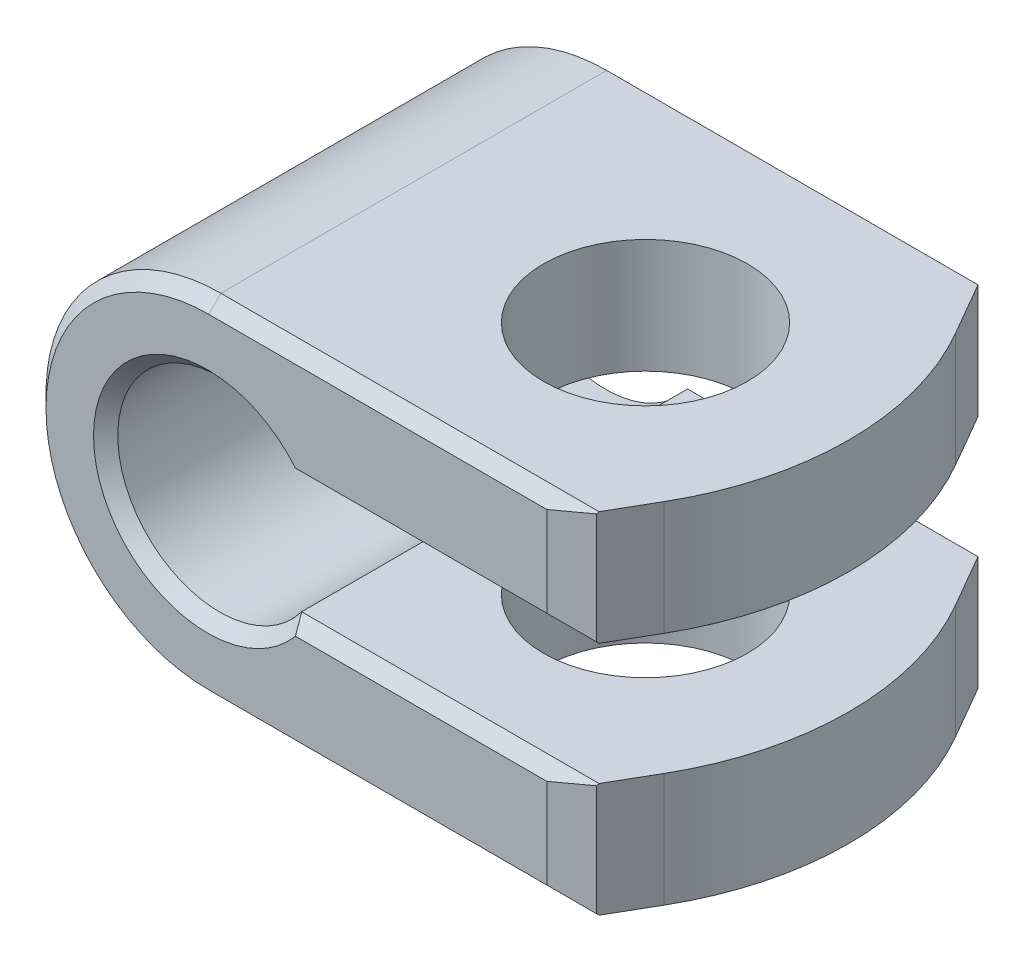
ISO-10303-21;
HEADER;
FILE_DESCRIPTION(('STEP AP214'),'2;1');
FILE_NAME('part.step','',(''),(''),'','','');
FILE_SCHEMA(('AUTOMOTIVE_DESIGN { 1 0 10303 214 1 1 1 1 }'));
ENDSEC;
DATA;
#1=APPLICATION_CONTEXT('core data for automotive mechanical design processes');
#2=APPLICATION_PROTOCOL_DEFINITION('international standard','automotive_design',2000,#1);
#3=PRODUCT_CONTEXT('',#1,'mechanical');
#4=PRODUCT('Part','Part','',(#3));
#5=PRODUCT_RELATED_PRODUCT_CATEGORY('part','',(#4));
#6=PRODUCT_DEFINITION_FORMATION('','',#4);
#7=PRODUCT_DEFINITION_CONTEXT('part definition',#1,'design');
#8=PRODUCT_DEFINITION('design','',#6,#7);
#9=PRODUCT_DEFINITION_SHAPE('','',#8);
#10=(LENGTH_UNIT() NAMED_UNIT(*) SI_UNIT(.MILLI.,.METRE.));
#11=(NAMED_UNIT(*) PLANE_ANGLE_UNIT() SI_UNIT($,.RADIAN.));
#12=(NAMED_UNIT(*) SI_UNIT($,.STERADIAN.) SOLID_ANGLE_UNIT());
#13=UNCERTAINTY_MEASURE_WITH_UNIT(LENGTH_MEASURE(1.E-05),#10,'distance_accuracy_value','');
#14=(GEOMETRIC_REPRESENTATION_CONTEXT(3) GLOBAL_UNCERTAINTY_ASSIGNED_CONTEXT((#13)) GLOBAL_UNIT_ASSIGNED_CONTEXT((#10,
#11,#12)) REPRESENTATION_CONTEXT('',''));
#15=CARTESIAN_POINT('',(0.,0.,0.));
#16=DIRECTION('',(0.,0.,1.));
#17=DIRECTION('',(1.,0.,0.));
#18=AXIS2_PLACEMENT_3D('',#15,#16,#17);
#19=CARTESIAN_POINT('',(27.2342711036777,-7.36965721625661,8.19999808837445));
#20=DIRECTION('',(0.866025403784442,0.,-0.499999999999994));
#21=DIRECTION('',(-0.499999999999994,0.,-0.866025403784442));
#22=AXIS2_PLACEMENT_3D('',#19,#20,#21);
#23=PLANE('',#22);
#24=DIRECTION('',(-0.499999999999994,0.,-0.866025403784442));
#25=VECTOR('',#24,1.);
#26=CARTESIAN_POINT('',(27.2342711036777,14.4,8.19999808837445));
#27=LINE('',#26,#25);
#28=CARTESIAN_POINT('',(23.77016948854,14.4,2.19999808837452));
#29=VERTEX_POINT('',#28);
#30=CARTESIAN_POINT('',(22.5000000000003,14.4,-1.00613961606655E-13));
#31=VERTEX_POINT('',#30);
#32=EDGE_CURVE('E364',#29,#31,#27,.T.);
#33=ORIENTED_EDGE('',*,*,#32,.F.);
#34=DIRECTION('',(0.,1.,0.));
#35=VECTOR('',#34,1.);
#36=CARTESIAN_POINT('',(23.77016948854,-7.36965721625661,2.19999808837452));
#37=LINE('',#36,#35);
#38=CARTESIAN_POINT('',(23.77016948854,9.69999999999998,2.19999808837452));
#39=VERTEX_POINT('',#38);
#40=EDGE_CURVE('E169',#29,#39,#37,.F.);
#41=ORIENTED_EDGE('',*,*,#40,.T.);
#42=DIRECTION('',(0.499999999999994,0.,0.866025403784442));
#43=VECTOR('',#42,1.);
#44=CARTESIAN_POINT('',(27.2342711036777,9.69999999999992,8.19999808837458));
#45=LINE('',#44,#43);
#46=CARTESIAN_POINT('',(22.5000000000003,9.7,-1.00613961606655E-13));
#47=VERTEX_POINT('',#46);
#48=EDGE_CURVE('E164',#47,#39,#45,.T.);
#49=ORIENTED_EDGE('',*,*,#48,.F.);
#50=DIRECTION('',(0.,1.,0.));
#51=VECTOR('',#50,1.);
#52=CARTESIAN_POINT('',(22.5000000000003,2.761840448622E-13,-1.00613961606655E-13));
#53=LINE('',#52,#51);
#54=EDGE_CURVE('E167',#47,#31,#53,.T.);
#55=ORIENTED_EDGE('',*,*,#54,.T.);
#56=EDGE_LOOP('',(#33,#41,#49,#55));
#57=FACE_BOUND('',#56,.T.);
#58=ADVANCED_FACE('F36',(#57),#23,.T.);
#59=CARTESIAN_POINT('',(22.5000000000003,-7.36965721625661,16.399996176749));
#60=DIRECTION('',(0.866025403784442,0.,0.499999999999994));
#61=DIRECTION('',(0.499999999999994,0.,-0.866025403784442));
#62=AXIS2_PLACEMENT_3D('',#59,#60,#61);
#63=PLANE('',#62);
#64=DIRECTION('',(0.499999999999994,0.,-0.866025403784442));
#65=VECTOR('',#64,1.);
#66=CARTESIAN_POINT('',(22.5000000000003,14.4,16.399996176749));
#67=LINE('',#66,#65);
#68=CARTESIAN_POINT('',(22.7886751345951,14.4,15.899996176749));
#69=VERTEX_POINT('',#68);
#70=CARTESIAN_POINT('',(23.77016948854,14.4,14.1999980883744));
#71=VERTEX_POINT('',#70);
#72=EDGE_CURVE('E368',#69,#71,#67,.T.);
#73=ORIENTED_EDGE('',*,*,#72,.F.);
#74=DIRECTION('',(0.377964473009224,0.654653670707976,-0.654653670707981));
#75=VECTOR('',#74,1.);
#76=CARTESIAN_POINT('',(17.2371247202674,4.78443262160434,25.5155635551447));
#77=LINE('',#76,#75);
#78=CARTESIAN_POINT('',(22.7500000000003,14.3330127018922,15.9669834748568));
#79=VERTEX_POINT('',#78);
#80=EDGE_CURVE('E265',#69,#79,#77,.F.);
#81=ORIENTED_EDGE('',*,*,#80,.T.);
#82=DIRECTION('',(0.,-1.,0.));
#83=VECTOR('',#82,1.);
#84=CARTESIAN_POINT('',(22.7500000000003,-7.36965721625661,15.9669834748568));
#85=LINE('',#84,#83);
#86=CARTESIAN_POINT('',(22.7500000000003,9.76698729810779,15.9669834748568));
#87=VERTEX_POINT('',#86);
#88=EDGE_CURVE('E263',#79,#87,#85,.T.);
#89=ORIENTED_EDGE('',*,*,#88,.T.);
#90=DIRECTION('',(0.377964473009222,-0.654653670707979,-0.654653670707978));
#91=VECTOR('',#90,1.);
#92=CARTESIAN_POINT('',(26.8473627100182,2.67014690731857,8.87014308406757));
#93=LINE('',#92,#91);
#94=CARTESIAN_POINT('',(22.7886751345951,9.69999999999996,15.899996176749));
#95=VERTEX_POINT('',#94);
#96=EDGE_CURVE('E261',#87,#95,#93,.T.);
#97=ORIENTED_EDGE('',*,*,#96,.T.);
#98=DIRECTION('',(-0.499999999999994,0.,0.866025403784442));
#99=VECTOR('',#98,1.);
#100=CARTESIAN_POINT('',(22.5000000000003,9.69999999999997,16.3999961767489));
#101=LINE('',#100,#99);
#102=CARTESIAN_POINT('',(23.77016948854,9.69999999999995,14.1999980883744));
#103=VERTEX_POINT('',#102);
#104=EDGE_CURVE('E174',#103,#95,#101,.T.);
#105=ORIENTED_EDGE('',*,*,#104,.F.);
#106=DIRECTION('',(0.,1.,0.));
#107=VECTOR('',#106,1.);
#108=CARTESIAN_POINT('',(23.77016948854,-7.36965721625661,14.1999980883744));
#109=LINE('',#108,#107);
#110=EDGE_CURVE('E218',#103,#71,#109,.T.);
#111=ORIENTED_EDGE('',*,*,#110,.T.);
#112=EDGE_LOOP('',(#73,#81,#89,#97,#105,#111));
#113=FACE_BOUND('',#112,.T.);
#114=ADVANCED_FACE('F326',(#113),#63,.T.);
#115=CARTESIAN_POINT('',(10.53268810596,9.70000000000017,16.399996176749));
#116=DIRECTION('',(0.,1.,0.));
#117=DIRECTION('',(-1.,0.,0.));
#118=AXIS2_PLACEMENT_3D('',#115,#116,#117);
#119=PLANE('',#118);
#120=CARTESIAN_POINT('',(17.0000000000003,9.70000000000008,8.19999999999995));
#121=DIRECTION('',(0.,1.,0.));
#122=DIRECTION('',(-1.,0.,0.));
#123=AXIS2_PLACEMENT_3D('',#120,#121,#122);
#124=CIRCLE('',#123,4.2);
#125=CARTESIAN_POINT('',(12.8000000000003,9.70000000000014,8.19999999999995));
#126=VERTEX_POINT('',#125);
#127=EDGE_CURVE('E194',#126,#126,#124,.T.);
#128=ORIENTED_EDGE('',*,*,#127,.T.);
#129=EDGE_LOOP('',(#128));
#130=FACE_BOUND('',#129,.T.);
#131=ORIENTED_EDGE('',*,*,#104,.T.);
#132=DIRECTION('',(-1.,0.,0.));
#133=VECTOR('',#132,1.);
#134=CARTESIAN_POINT('',(11.1377304482493,9.70000000000016,15.899996176749));
#135=LINE('',#134,#133);
#136=CARTESIAN_POINT('',(10.53268810596,9.70000000000017,15.899996176749));
#137=VERTEX_POINT('',#136);
#138=EDGE_CURVE('E277',#95,#137,#135,.T.);
#139=ORIENTED_EDGE('',*,*,#138,.T.);
#140=DIRECTION('',(0.,0.,-1.));
#141=VECTOR('',#140,1.);
#142=CARTESIAN_POINT('',(10.53268810596,9.70000000000017,16.399996176749));
#143=LINE('',#142,#141);
#144=CARTESIAN_POINT('',(10.53268810596,9.70000000000017,0.));
#145=VERTEX_POINT('',#144);
#146=EDGE_CURVE('E191',#137,#145,#143,.T.);
#147=ORIENTED_EDGE('',*,*,#146,.T.);
#148=DIRECTION('',(1.,0.,0.));
#149=VECTOR('',#148,1.);
#150=CARTESIAN_POINT('',(10.53268810596,9.70000000000017,0.));
#151=LINE('',#150,#149);
#152=EDGE_CURVE('E181',#145,#47,#151,.T.);
#153=ORIENTED_EDGE('',*,*,#152,.T.);
#154=ORIENTED_EDGE('',*,*,#48,.T.);
#155=CARTESIAN_POINT('',(13.3778646431267,9.70000000000013,8.19999808837445));
#156=DIRECTION('',(0.,1.,0.));
#157=DIRECTION('',(-1.,0.,0.));
#158=AXIS2_PLACEMENT_3D('',#155,#156,#157);
#159=CIRCLE('',#158,12.);
#160=EDGE_CURVE('E228',#39,#103,#159,.F.);
#161=ORIENTED_EDGE('',*,*,#160,.T.);
#162=EDGE_LOOP('',(#131,#139,#147,#153,#154,#161));
#163=FACE_BOUND('',#162,.T.);
#164=ADVANCED_FACE('F189',(#130,#163),#119,.F.);
#165=CARTESIAN_POINT('',(7.20000000000028,7.20000000000014,-1.00613961606655E-13));
#166=DIRECTION('',(0.,0.,1.));
#167=DIRECTION('',(1.,0.,0.));
#168=AXIS2_PLACEMENT_3D('',#165,#166,#167);
#169=CYLINDRICAL_SURFACE('',#168,7.19999999999986);
#170=DIRECTION('',(0.,0.,1.));
#171=VECTOR('',#170,1.);
#172=CARTESIAN_POINT('',(7.20000000000028,2.761840448622E-13,-1.00613961606655E-13));
#173=LINE('',#172,#171);
#174=CARTESIAN_POINT('',(7.20000000000028,2.761840448622E-13,-1.00613961606655E-13));
#175=VERTEX_POINT('',#174);
#176=CARTESIAN_POINT('',(7.20000000000028,2.761840448622E-13,15.899996176749));
#177=VERTEX_POINT('',#176);
#178=EDGE_CURVE('E215',#175,#177,#173,.T.);
#179=ORIENTED_EDGE('',*,*,#178,.T.);
#180=CARTESIAN_POINT('',(7.20000000000028,7.20000000000014,15.899996176749));
#181=DIRECTION('',(0.,0.,1.));
#182=DIRECTION('',(1.,0.,0.));
#183=AXIS2_PLACEMENT_3D('',#180,#181,#182);
#184=CIRCLE('',#183,7.19999999999986);
#185=CARTESIAN_POINT('',(7.20000000000028,14.4,15.899996176749));
#186=VERTEX_POINT('',#185);
#187=EDGE_CURVE('E54',#177,#186,#184,.F.);
#188=ORIENTED_EDGE('',*,*,#187,.T.);
#189=DIRECTION('',(0.,0.,1.));
#190=VECTOR('',#189,1.);
#191=CARTESIAN_POINT('',(7.20000000000028,14.4,-1.00613961606655E-13));
#192=LINE('',#191,#190);
#193=CARTESIAN_POINT('',(7.20000000000028,14.4,-1.00613961606655E-13));
#194=VERTEX_POINT('',#193);
#195=EDGE_CURVE('E216',#194,#186,#192,.T.);
#196=ORIENTED_EDGE('',*,*,#195,.F.);
#197=CARTESIAN_POINT('',(7.20000000000028,7.20000000000014,-1.00613961606655E-13));
#198=DIRECTION('',(0.,0.,1.));
#199=DIRECTION('',(1.,0.,0.));
#200=AXIS2_PLACEMENT_3D('',#197,#198,#199);
#201=CIRCLE('',#200,7.19999999999986);
#202=EDGE_CURVE('E207',#194,#175,#201,.T.);
#203=ORIENTED_EDGE('',*,*,#202,.T.);
#204=EDGE_LOOP('',(#179,#188,#196,#203));
#205=FACE_BOUND('',#204,.T.);
#206=ADVANCED_FACE('F381',(#205),#169,.T.);
#207=CARTESIAN_POINT('',(22.5000000000003,14.4,-1.00613961606655E-13));
#208=DIRECTION('',(0.,1.,0.));
#209=DIRECTION('',(0.,0.,1.));
#210=AXIS2_PLACEMENT_3D('',#207,#208,#209);
#211=PLANE('',#210);
#212=CARTESIAN_POINT('',(17.0000000000004,14.4000000000001,8.19999999999995));
#213=DIRECTION('',(0.,-1.,0.));
#214=DIRECTION('',(1.,0.,0.));
#215=AXIS2_PLACEMENT_3D('',#212,#213,#214);
#216=CIRCLE('',#215,4.2);
#217=CARTESIAN_POINT('',(21.2000000000004,14.4,8.19999999999995));
#218=VERTEX_POINT('',#217);
#219=EDGE_CURVE('E222',#218,#218,#216,.T.);
#220=ORIENTED_EDGE('',*,*,#219,.T.);
#221=EDGE_LOOP('',(#220));
#222=FACE_BOUND('',#221,.T.);
#223=ORIENTED_EDGE('',*,*,#195,.T.);
#224=DIRECTION('',(1.,0.,0.));
#225=VECTOR('',#224,1.);
#226=CARTESIAN_POINT('',(22.5000000000003,14.4,15.899996176749));
#227=LINE('',#226,#225);
#228=EDGE_CURVE('E275',#186,#69,#227,.T.);
#229=ORIENTED_EDGE('',*,*,#228,.T.);
#230=ORIENTED_EDGE('',*,*,#72,.T.);
#231=CARTESIAN_POINT('',(13.3778646431267,14.4,8.19999808837445));
#232=DIRECTION('',(0.,1.,0.));
#233=DIRECTION('',(0.,0.,1.));
#234=AXIS2_PLACEMENT_3D('',#231,#232,#233);
#235=CIRCLE('',#234,12.);
#236=EDGE_CURVE('E225',#71,#29,#235,.T.);
#237=ORIENTED_EDGE('',*,*,#236,.T.);
#238=ORIENTED_EDGE('',*,*,#32,.T.);
#239=DIRECTION('',(-1.,0.,0.));
#240=VECTOR('',#239,1.);
#241=CARTESIAN_POINT('',(22.5000000000003,14.4,-1.00613961606655E-13));
#242=LINE('',#241,#240);
#243=EDGE_CURVE('E184',#31,#194,#242,.T.);
#244=ORIENTED_EDGE('',*,*,#243,.T.);
#245=EDGE_LOOP('',(#223,#229,#230,#237,#238,#244));
#246=FACE_BOUND('',#245,.T.);
#247=ADVANCED_FACE('F375',(#222,#246),#211,.T.);
#248=CARTESIAN_POINT('',(7.20000000000028,2.761840448622E-13,-1.00613961606655E-13));
#249=DIRECTION('',(0.,-1.,0.));
#250=DIRECTION('',(0.,0.,-1.));
#251=AXIS2_PLACEMENT_3D('',#248,#249,#250);
#252=PLANE('',#251);
#253=CARTESIAN_POINT('',(17.0000000000002,0.,8.19999999999995));
#254=DIRECTION('',(0.,-1.,0.));
#255=DIRECTION('',(1.,0.,0.));
#256=AXIS2_PLACEMENT_3D('',#253,#254,#255);
#257=CIRCLE('',#256,4.2);
#258=CARTESIAN_POINT('',(21.2000000000002,0.,8.19999999999995));
#259=VERTEX_POINT('',#258);
#260=EDGE_CURVE('E370',#259,#259,#257,.T.);
#261=ORIENTED_EDGE('',*,*,#260,.F.);
#262=EDGE_LOOP('',(#261));
#263=FACE_BOUND('',#262,.T.);
#264=DIRECTION('',(0.499999999999994,0.,-0.866025403784442));
#265=VECTOR('',#264,1.);
#266=CARTESIAN_POINT('',(22.5000000000002,0.,16.399996176749));
#267=LINE('',#266,#265);
#268=CARTESIAN_POINT('',(22.788675134595,0.,15.899996176749));
#269=VERTEX_POINT('',#268);
#270=CARTESIAN_POINT('',(23.7701694885399,0.,14.1999980883743));
#271=VERTEX_POINT('',#270);
#272=EDGE_CURVE('E361',#269,#271,#267,.T.);
#273=ORIENTED_EDGE('',*,*,#272,.F.);
#274=DIRECTION('',(-1.,0.,0.));
#275=VECTOR('',#274,1.);
#276=CARTESIAN_POINT('',(7.20000000000028,2.761840448622E-13,15.899996176749));
#277=LINE('',#276,#275);
#278=EDGE_CURVE('E62',#269,#177,#277,.T.);
#279=ORIENTED_EDGE('',*,*,#278,.T.);
#280=ORIENTED_EDGE('',*,*,#178,.F.);
#281=DIRECTION('',(1.,0.,0.));
#282=VECTOR('',#281,1.);
#283=CARTESIAN_POINT('',(7.20000000000028,2.761840448622E-13,-1.00613961606655E-13));
#284=LINE('',#283,#282);
#285=CARTESIAN_POINT('',(22.5000000000002,0.,-1.00613961606655E-13));
#286=VERTEX_POINT('',#285);
#287=EDGE_CURVE('E186',#175,#286,#284,.T.);
#288=ORIENTED_EDGE('',*,*,#287,.T.);
#289=DIRECTION('',(-0.499999999999994,0.,-0.866025403784442));
#290=VECTOR('',#289,1.);
#291=CARTESIAN_POINT('',(27.2342711036776,0.,8.19999808837445));
#292=LINE('',#291,#290);
#293=CARTESIAN_POINT('',(23.7701694885399,0.,2.19999808837457));
#294=VERTEX_POINT('',#293);
#295=EDGE_CURVE('E173',#294,#286,#292,.T.);
#296=ORIENTED_EDGE('',*,*,#295,.F.);
#297=CARTESIAN_POINT('',(13.3778646431267,2.75821032680312E-13,8.19999808837445));
#298=DIRECTION('',(0.,-1.,0.));
#299=DIRECTION('',(0.,0.,-1.));
#300=AXIS2_PLACEMENT_3D('',#297,#298,#299);
#301=CIRCLE('',#300,12.);
#302=EDGE_CURVE('E237',#294,#271,#301,.T.);
#303=ORIENTED_EDGE('',*,*,#302,.T.);
#304=EDGE_LOOP('',(#273,#279,#280,#288,#296,#303));
#305=FACE_BOUND('',#304,.T.);
#306=ADVANCED_FACE('F360',(#263,#305),#252,.T.);
#307=CARTESIAN_POINT('',(7.20000000000028,7.20000000000014,-1.00613961606655E-13));
#308=DIRECTION('',(0.,0.,1.));
#309=DIRECTION('',(1.,0.,0.));
#310=AXIS2_PLACEMENT_3D('',#307,#308,#309);
#311=PLANE('',#310);
#312=ORIENTED_EDGE('',*,*,#54,.F.);
#313=ORIENTED_EDGE('',*,*,#152,.F.);
#314=CARTESIAN_POINT('',(7.15778069982282,7.20000000000008,0.));
#315=DIRECTION('',(0.,0.,-1.));
#316=DIRECTION('',(1.,0.,0.));
#317=AXIS2_PLACEMENT_3D('',#314,#315,#316);
#318=CIRCLE('',#317,4.2);
#319=CARTESIAN_POINT('',(10.53268810596,4.7,0.));
#320=VERTEX_POINT('',#319);
#321=EDGE_CURVE('E197',#320,#145,#318,.T.);
#322=ORIENTED_EDGE('',*,*,#321,.F.);
#323=DIRECTION('',(-1.,0.,0.));
#324=VECTOR('',#323,1.);
#325=CARTESIAN_POINT('',(22.5,4.7,0.));
#326=LINE('',#325,#324);
#327=CARTESIAN_POINT('',(22.5,4.7,0.));
#328=VERTEX_POINT('',#327);
#329=EDGE_CURVE('E193',#328,#320,#326,.T.);
#330=ORIENTED_EDGE('',*,*,#329,.F.);
#331=EDGE_CURVE('E185',#286,#328,#53,.T.);
#332=ORIENTED_EDGE('',*,*,#331,.F.);
#333=ORIENTED_EDGE('',*,*,#287,.F.);
#334=ORIENTED_EDGE('',*,*,#202,.F.);
#335=ORIENTED_EDGE('',*,*,#243,.F.);
#336=EDGE_LOOP('',(#312,#313,#322,#330,#332,#333,#334,#335));
#337=FACE_BOUND('',#336,.T.);
#338=ADVANCED_FACE('F179',(#337),#311,.F.);
#339=CARTESIAN_POINT('',(7.20000000000028,7.20000000000014,16.399996176749));
#340=DIRECTION('',(0.,0.,1.));
#341=DIRECTION('',(1.,0.,0.));
#342=AXIS2_PLACEMENT_3D('',#339,#340,#341);
#343=PLANE('',#342);
#344=CARTESIAN_POINT('',(7.15778069982282,7.20000000000008,16.399996176749));
#345=DIRECTION('',(0.,0.,1.));
#346=DIRECTION('',(1.,0.,0.));
#347=AXIS2_PLACEMENT_3D('',#344,#345,#346);
#348=CIRCLE('',#347,4.70000000000001);
#349=CARTESIAN_POINT('',(10.7757912028479,4.2,16.399996176749));
#350=VERTEX_POINT('',#349);
#351=CARTESIAN_POINT('',(10.7757912028479,10.2000000000002,16.399996176749));
#352=VERTEX_POINT('',#351);
#353=EDGE_CURVE('E240',#350,#352,#348,.F.);
#354=ORIENTED_EDGE('',*,*,#353,.T.);
#355=DIRECTION('',(1.,0.,0.));
#356=VECTOR('',#355,1.);
#357=CARTESIAN_POINT('',(22.5000000000003,10.2,16.399996176749));
#358=LINE('',#357,#356);
#359=CARTESIAN_POINT('',(21.1339745962159,10.2,16.399996176749));
#360=VERTEX_POINT('',#359);
#361=EDGE_CURVE('E259',#352,#360,#358,.T.);
#362=ORIENTED_EDGE('',*,*,#361,.T.);
#363=DIRECTION('',(0.,1.,0.));
#364=VECTOR('',#363,1.);
#365=CARTESIAN_POINT('',(21.1339745962159,7.20000000000014,16.399996176749));
#366=LINE('',#365,#364);
#367=CARTESIAN_POINT('',(21.1339745962159,13.9,16.399996176749));
#368=VERTEX_POINT('',#367);
#369=EDGE_CURVE('E256',#360,#368,#366,.T.);
#370=ORIENTED_EDGE('',*,*,#369,.T.);
#371=DIRECTION('',(-1.,0.,0.));
#372=VECTOR('',#371,1.);
#373=CARTESIAN_POINT('',(7.20000000000028,13.9,16.399996176749));
#374=LINE('',#373,#372);
#375=CARTESIAN_POINT('',(7.20000000000028,13.9,16.399996176749));
#376=VERTEX_POINT('',#375);
#377=EDGE_CURVE('E254',#368,#376,#374,.T.);
#378=ORIENTED_EDGE('',*,*,#377,.T.);
#379=CARTESIAN_POINT('',(7.20000000000028,7.20000000000014,16.399996176749));
#380=DIRECTION('',(0.,0.,1.));
#381=DIRECTION('',(1.,0.,0.));
#382=AXIS2_PLACEMENT_3D('',#379,#380,#381);
#383=CIRCLE('',#382,6.69999999999985);
#384=CARTESIAN_POINT('',(7.20000000000028,0.500000000000283,16.399996176749));
#385=VERTEX_POINT('',#384);
#386=EDGE_CURVE('E252',#376,#385,#383,.T.);
#387=ORIENTED_EDGE('',*,*,#386,.T.);
#388=DIRECTION('',(1.,0.,0.));
#389=VECTOR('',#388,1.);
#390=CARTESIAN_POINT('',(7.20000000000028,0.500000000000283,16.399996176749));
#391=LINE('',#390,#389);
#392=CARTESIAN_POINT('',(21.1339745962159,0.500000000000283,16.399996176749));
#393=VERTEX_POINT('',#392);
#394=EDGE_CURVE('E250',#385,#393,#391,.T.);
#395=ORIENTED_EDGE('',*,*,#394,.T.);
#396=DIRECTION('',(0.,1.,0.));
#397=VECTOR('',#396,1.);
#398=CARTESIAN_POINT('',(21.1339745962159,7.20000000000014,16.399996176749));
#399=LINE('',#398,#397);
#400=CARTESIAN_POINT('',(21.1339745962159,4.2,16.399996176749));
#401=VERTEX_POINT('',#400);
#402=EDGE_CURVE('E248',#393,#401,#399,.T.);
#403=ORIENTED_EDGE('',*,*,#402,.T.);
#404=DIRECTION('',(-1.,0.,0.));
#405=VECTOR('',#404,1.);
#406=CARTESIAN_POINT('',(11.1377304482493,4.2,16.399996176749));
#407=LINE('',#406,#405);
#408=EDGE_CURVE('E246',#401,#350,#407,.T.);
#409=ORIENTED_EDGE('',*,*,#408,.T.);
#410=EDGE_LOOP('',(#354,#362,#370,#378,#387,#395,#403,#409));
#411=FACE_BOUND('',#410,.T.);
#412=ADVANCED_FACE('F393',(#411),#343,.T.);
#413=CARTESIAN_POINT('',(7.15778069982282,7.20000000000008,16.399996176749));
#414=DIRECTION('',(0.,0.,-1.));
#415=DIRECTION('',(-1.,0.,0.));
#416=AXIS2_PLACEMENT_3D('',#413,#414,#415);
#417=CYLINDRICAL_SURFACE('',#416,4.2);
#418=ORIENTED_EDGE('',*,*,#146,.F.);
#419=CARTESIAN_POINT('',(7.15778069982282,7.20000000000008,15.899996176749));
#420=DIRECTION('',(0.,0.,1.));
#421=DIRECTION('',(1.,0.,0.));
#422=AXIS2_PLACEMENT_3D('',#419,#420,#421);
#423=CIRCLE('',#422,4.2);
#424=CARTESIAN_POINT('',(10.53268810596,4.7,15.899996176749));
#425=VERTEX_POINT('',#424);
#426=EDGE_CURVE('E243',#137,#425,#423,.T.);
#427=ORIENTED_EDGE('',*,*,#426,.T.);
#428=DIRECTION('',(0.,0.,-1.));
#429=VECTOR('',#428,1.);
#430=CARTESIAN_POINT('',(10.53268810596,4.7,16.399996176749));
#431=LINE('',#430,#429);
#432=EDGE_CURVE('E205',#425,#320,#431,.T.);
#433=ORIENTED_EDGE('',*,*,#432,.T.);
#434=ORIENTED_EDGE('',*,*,#321,.T.);
#435=EDGE_LOOP('',(#418,#427,#433,#434));
#436=FACE_BOUND('',#435,.T.);
#437=ADVANCED_FACE('F396',(#436),#417,.F.);
#438=CARTESIAN_POINT('',(22.5,4.7,16.399996176749));
#439=DIRECTION('',(0.,-1.,0.));
#440=DIRECTION('',(0.,0.,-1.));
#441=AXIS2_PLACEMENT_3D('',#438,#439,#440);
#442=PLANE('',#441);
#443=CARTESIAN_POINT('',(17.0000000000002,4.7,8.19999999999995));
#444=DIRECTION('',(0.,-1.,0.));
#445=DIRECTION('',(0.,0.,-1.));
#446=AXIS2_PLACEMENT_3D('',#443,#444,#445);
#447=CIRCLE('',#446,4.2);
#448=CARTESIAN_POINT('',(17.0000000000002,4.7,3.99999999999995));
#449=VERTEX_POINT('',#448);
#450=EDGE_CURVE('E200',#449,#449,#447,.T.);
#451=ORIENTED_EDGE('',*,*,#450,.T.);
#452=EDGE_LOOP('',(#451));
#453=FACE_BOUND('',#452,.T.);
#454=ORIENTED_EDGE('',*,*,#432,.F.);
#455=DIRECTION('',(1.,0.,0.));
#456=VECTOR('',#455,1.);
#457=CARTESIAN_POINT('',(22.5000000000002,4.7,15.899996176749));
#458=LINE('',#457,#456);
#459=CARTESIAN_POINT('',(22.7886751345951,4.69999999999999,15.899996176749));
#460=VERTEX_POINT('',#459);
#461=EDGE_CURVE('E11',#425,#460,#458,.T.);
#462=ORIENTED_EDGE('',*,*,#461,.T.);
#463=DIRECTION('',(0.499999999999994,0.,-0.866025403784442));
#464=VECTOR('',#463,1.);
#465=CARTESIAN_POINT('',(22.5000000000003,4.7,16.3999961767489));
#466=LINE('',#465,#464);
#467=CARTESIAN_POINT('',(23.77016948854,4.69999999999998,14.1999980883744));
#468=VERTEX_POINT('',#467);
#469=EDGE_CURVE('E354',#460,#468,#466,.T.);
#470=ORIENTED_EDGE('',*,*,#469,.T.);
#471=CARTESIAN_POINT('',(13.3778646431267,4.7,8.19999808837445));
#472=DIRECTION('',(0.,-1.,0.));
#473=DIRECTION('',(0.,0.,-1.));
#474=AXIS2_PLACEMENT_3D('',#471,#472,#473);
#475=CIRCLE('',#474,12.);
#476=CARTESIAN_POINT('',(23.77016948854,4.69999999999998,2.19999808837452));
#477=VERTEX_POINT('',#476);
#478=EDGE_CURVE('E233',#468,#477,#475,.F.);
#479=ORIENTED_EDGE('',*,*,#478,.T.);
#480=DIRECTION('',(-0.499999999999994,0.,-0.866025403784442));
#481=VECTOR('',#480,1.);
#482=CARTESIAN_POINT('',(27.2342711036777,4.69999999999993,8.19999808837453));
#483=LINE('',#482,#481);
#484=EDGE_CURVE('E348',#477,#328,#483,.T.);
#485=ORIENTED_EDGE('',*,*,#484,.T.);
#486=ORIENTED_EDGE('',*,*,#329,.T.);
#487=EDGE_LOOP('',(#454,#462,#470,#479,#485,#486));
#488=FACE_BOUND('',#487,.T.);
#489=ADVANCED_FACE('F389',(#453,#488),#442,.F.);
#490=CARTESIAN_POINT('',(17.0000000000004,14.4000000000001,8.19999999999995));
#491=DIRECTION('',(0.,-1.,0.));
#492=DIRECTION('',(1.,0.,0.));
#493=AXIS2_PLACEMENT_3D('',#490,#491,#492);
#494=CYLINDRICAL_SURFACE('',#493,4.2);
#495=ORIENTED_EDGE('',*,*,#260,.T.);
#496=EDGE_LOOP('',(#495));
#497=FACE_BOUND('',#496,.T.);
#498=ORIENTED_EDGE('',*,*,#450,.F.);
#499=EDGE_LOOP('',(#498));
#500=FACE_BOUND('',#499,.T.);
#501=ADVANCED_FACE('F345',(#497,#500),#494,.F.);
#502=ORIENTED_EDGE('',*,*,#219,.F.);
#503=EDGE_LOOP('',(#502));
#504=FACE_BOUND('',#503,.T.);
#505=ORIENTED_EDGE('',*,*,#127,.F.);
#506=EDGE_LOOP('',(#505));
#507=FACE_BOUND('',#506,.T.);
#508=ADVANCED_FACE('F337',(#504,#507),#494,.F.);
#509=ORIENTED_EDGE('',*,*,#484,.F.);
#510=DIRECTION('',(0.,1.,0.));
#511=VECTOR('',#510,1.);
#512=CARTESIAN_POINT('',(23.77016948854,-7.36965721625661,2.19999808837452));
#513=LINE('',#512,#511);
#514=EDGE_CURVE('E235',#477,#294,#513,.F.);
#515=ORIENTED_EDGE('',*,*,#514,.T.);
#516=ORIENTED_EDGE('',*,*,#295,.T.);
#517=ORIENTED_EDGE('',*,*,#331,.T.);
#518=EDGE_LOOP('',(#509,#515,#516,#517));
#519=FACE_BOUND('',#518,.T.);
#520=ADVANCED_FACE('F328',(#519),#23,.T.);
#521=DIRECTION('',(0.,-1.,0.));
#522=VECTOR('',#521,1.);
#523=CARTESIAN_POINT('',(22.7500000000003,-7.36965721625661,15.9669834748568));
#524=LINE('',#523,#522);
#525=CARTESIAN_POINT('',(22.7500000000003,4.63301270189222,15.9669834748568));
#526=VERTEX_POINT('',#525);
#527=CARTESIAN_POINT('',(22.7500000000003,0.0669872981080679,15.9669834748568));
#528=VERTEX_POINT('',#527);
#529=EDGE_CURVE('E269',#526,#528,#524,.T.);
#530=ORIENTED_EDGE('',*,*,#529,.T.);
#531=DIRECTION('',(-0.377964473009224,0.654653670707976,0.654653670707981));
#532=VECTOR('',#531,1.);
#533=CARTESIAN_POINT('',(24.4472351623871,-2.87271023553837,13.0272859412103));
#534=LINE('',#533,#532);
#535=EDGE_CURVE('E271',#528,#269,#534,.F.);
#536=ORIENTED_EDGE('',*,*,#535,.T.);
#537=ORIENTED_EDGE('',*,*,#272,.T.);
#538=DIRECTION('',(0.,1.,0.));
#539=VECTOR('',#538,1.);
#540=CARTESIAN_POINT('',(23.77016948854,-7.36965721625661,14.1999980883744));
#541=LINE('',#540,#539);
#542=EDGE_CURVE('E230',#271,#468,#541,.T.);
#543=ORIENTED_EDGE('',*,*,#542,.T.);
#544=ORIENTED_EDGE('',*,*,#469,.F.);
#545=DIRECTION('',(-0.377964473009222,-0.654653670707979,0.654653670707979));
#546=VECTOR('',#545,1.);
#547=CARTESIAN_POINT('',(19.6372522678985,-0.758424521252856,21.3584206980019));
#548=LINE('',#547,#546);
#549=EDGE_CURVE('E267',#460,#526,#548,.T.);
#550=ORIENTED_EDGE('',*,*,#549,.T.);
#551=EDGE_LOOP('',(#530,#536,#537,#543,#544,#550));
#552=FACE_BOUND('',#551,.T.);
#553=ADVANCED_FACE('F334',(#552),#63,.T.);
#554=CARTESIAN_POINT('',(13.3778646431267,-7.36965721625661,8.19999808837445));
#555=DIRECTION('',(0.,1.,0.));
#556=DIRECTION('',(0.,0.,1.));
#557=AXIS2_PLACEMENT_3D('',#554,#555,#556);
#558=CYLINDRICAL_SURFACE('',#557,12.);
#559=ORIENTED_EDGE('',*,*,#160,.F.);
#560=ORIENTED_EDGE('',*,*,#40,.F.);
#561=ORIENTED_EDGE('',*,*,#236,.F.);
#562=ORIENTED_EDGE('',*,*,#110,.F.);
#563=EDGE_LOOP('',(#559,#560,#561,#562));
#564=FACE_BOUND('',#563,.T.);
#565=ADVANCED_FACE('F343',(#564),#558,.T.);
#566=CARTESIAN_POINT('',(13.3778646431267,-7.36965721625661,8.19999808837445));
#567=DIRECTION('',(0.,1.,0.));
#568=DIRECTION('',(0.,0.,1.));
#569=AXIS2_PLACEMENT_3D('',#566,#567,#568);
#570=CYLINDRICAL_SURFACE('',#569,12.);
#571=ORIENTED_EDGE('',*,*,#302,.F.);
#572=ORIENTED_EDGE('',*,*,#514,.F.);
#573=ORIENTED_EDGE('',*,*,#478,.F.);
#574=ORIENTED_EDGE('',*,*,#542,.F.);
#575=EDGE_LOOP('',(#571,#572,#573,#574));
#576=FACE_BOUND('',#575,.T.);
#577=ADVANCED_FACE('F294',(#576),#570,.T.);
#578=CARTESIAN_POINT('',(7.15778069982282,7.20000000000008,16.399996176749));
#579=DIRECTION('',(0.,0.,1.));
#580=DIRECTION('',(1.,0.,0.));
#581=AXIS2_PLACEMENT_3D('',#578,#579,#580);
#582=CONICAL_SURFACE('',#581,4.70000000000001,0.785398163397445);
#583=ORIENTED_EDGE('',*,*,#426,.F.);
#584=CARTESIAN_POINT('',(10.53268810596,9.70000000000017,15.899996176749));
#585=CARTESIAN_POINT('',(10.5744647090907,9.78302731389498,15.9830234906438));
#586=CARTESIAN_POINT('',(10.6156116335621,9.86620770461764,16.0662038813665));
#587=CARTESIAN_POINT('',(10.6966459951496,10.0328743722669,16.2328705490157));
#588=CARTESIAN_POINT('',(10.7365334363075,10.1163606482109,16.3163568249597));
#589=CARTESIAN_POINT('',(10.7757912028479,10.2000000000002,16.399996176749));
#590=B_SPLINE_CURVE_WITH_KNOTS('',3,(#584,#585,#586,#587,#588,#589),.UNSPECIFIED.,.F.,.F.,(4,2,
4),(0.,0.373870589582891,0.747739979259389),.UNSPECIFIED.);
#591=EDGE_CURVE('E46',#137,#352,#590,.T.);
#592=ORIENTED_EDGE('',*,*,#591,.T.);
#593=ORIENTED_EDGE('',*,*,#353,.F.);
#594=CARTESIAN_POINT('',(10.7757912028479,4.2,16.399996176749));
#595=CARTESIAN_POINT('',(10.7365334363073,4.28363935178922,16.3163568249598));
#596=CARTESIAN_POINT('',(10.6966459951494,4.36712562773322,16.2328705490158));
#597=CARTESIAN_POINT('',(10.6156116335624,4.53379229538258,16.0662038813664));
#598=CARTESIAN_POINT('',(10.5744647090915,4.61697268610537,15.9830234906436));
#599=CARTESIAN_POINT('',(10.5326881059616,4.70000000000037,15.8999961767486));
#600=B_SPLINE_CURVE_WITH_KNOTS('',3,(#594,#595,#596,#597,#598,#599),.UNSPECIFIED.,.F.,.F.,(4,2,
4),(0.,0.373869389676491,0.747739979259362),.UNSPECIFIED.);
#601=EDGE_CURVE('E279',#350,#425,#600,.T.);
#602=ORIENTED_EDGE('',*,*,#601,.T.);
#603=EDGE_LOOP('',(#583,#592,#593,#602));
#604=FACE_BOUND('',#603,.T.);
#605=ADVANCED_FACE('F289',(#604),#582,.F.);
#606=CARTESIAN_POINT('',(7.20000000000028,4.2,16.399996176749));
#607=DIRECTION('',(0.,0.707106781186547,0.707106781186547));
#608=DIRECTION('',(1.,0.,0.));
#609=AXIS2_PLACEMENT_3D('',#606,#607,#608);
#610=PLANE('',#609);
#611=ORIENTED_EDGE('',*,*,#601,.F.);
#612=ORIENTED_EDGE('',*,*,#408,.F.);
#613=DIRECTION('',(-0.935113126531027,-0.250562807085736,0.250562807085736));
#614=VECTOR('',#613,1.);
#615=CARTESIAN_POINT('',(8.94959779138595,0.935206074869246,19.6647901018798));
#616=LINE('',#615,#614);
#617=EDGE_CURVE('E41',#526,#401,#616,.T.);
#618=ORIENTED_EDGE('',*,*,#617,.F.);
#619=ORIENTED_EDGE('',*,*,#549,.F.);
#620=ORIENTED_EDGE('',*,*,#461,.F.);
#621=EDGE_LOOP('',(#611,#612,#618,#619,#620));
#622=FACE_BOUND('',#621,.T.);
#623=ADVANCED_FACE('F38',(#622),#610,.T.);
#624=CARTESIAN_POINT('',(21.1339745962159,7.20000000000014,16.399996176749));
#625=DIRECTION('',(-0.258819045102526,0.,-0.965925826289067));
#626=DIRECTION('',(0.,1.,0.));
#627=AXIS2_PLACEMENT_3D('',#624,#625,#626);
#628=PLANE('',#627);
#629=ORIENTED_EDGE('',*,*,#617,.T.);
#630=ORIENTED_EDGE('',*,*,#402,.F.);
#631=DIRECTION('',(-0.935113126531027,0.250562807085735,0.250562807085736));
#632=VECTOR('',#631,1.);
#633=CARTESIAN_POINT('',(8.94959779138594,3.76479392513101,19.6647901018798));
#634=LINE('',#633,#632);
#635=EDGE_CURVE('E416',#528,#393,#634,.T.);
#636=ORIENTED_EDGE('',*,*,#635,.F.);
#637=ORIENTED_EDGE('',*,*,#529,.F.);
#638=EDGE_LOOP('',(#629,#630,#636,#637));
#639=FACE_BOUND('',#638,.T.);
#640=ADVANCED_FACE('F316',(#639),#628,.F.);
#641=CARTESIAN_POINT('',(7.20000000000028,0.500000000000283,16.399996176749));
#642=DIRECTION('',(0.,0.70710678118655,-0.707106781186545));
#643=DIRECTION('',(1.,0.,0.));
#644=AXIS2_PLACEMENT_3D('',#641,#642,#643);
#645=PLANE('',#644);
#646=ORIENTED_EDGE('',*,*,#635,.T.);
#647=ORIENTED_EDGE('',*,*,#394,.F.);
#648=DIRECTION('',(0.,0.707106781186545,0.70710678118655));
#649=VECTOR('',#648,1.);
#650=CARTESIAN_POINT('',(7.20000000000028,2.761840448622E-13,15.899996176749));
#651=LINE('',#650,#649);
#652=EDGE_CURVE('E421',#177,#385,#651,.T.);
#653=ORIENTED_EDGE('',*,*,#652,.F.);
#654=ORIENTED_EDGE('',*,*,#278,.F.);
#655=ORIENTED_EDGE('',*,*,#535,.F.);
#656=EDGE_LOOP('',(#646,#647,#653,#654,#655));
#657=FACE_BOUND('',#656,.T.);
#658=ADVANCED_FACE('F313',(#657),#645,.F.);
#659=CARTESIAN_POINT('',(7.20000000000028,7.20000000000014,16.399996176749));
#660=DIRECTION('',(0.,0.,-1.));
#661=DIRECTION('',(-1.,0.,0.));
#662=AXIS2_PLACEMENT_3D('',#659,#660,#661);
#663=CONICAL_SURFACE('',#662,6.69999999999985,0.785398163397445);
#664=ORIENTED_EDGE('',*,*,#652,.T.);
#665=ORIENTED_EDGE('',*,*,#386,.F.);
#666=DIRECTION('',(0.,-0.707106781186545,0.70710678118655));
#667=VECTOR('',#666,1.);
#668=CARTESIAN_POINT('',(7.20000000000028,14.4,15.899996176749));
#669=LINE('',#668,#667);
#670=EDGE_CURVE('E426',#186,#376,#669,.T.);
#671=ORIENTED_EDGE('',*,*,#670,.F.);
#672=ORIENTED_EDGE('',*,*,#187,.F.);
#673=EDGE_LOOP('',(#664,#665,#671,#672));
#674=FACE_BOUND('',#673,.T.);
#675=ADVANCED_FACE('F309',(#674),#663,.T.);
#676=CARTESIAN_POINT('',(7.20000000000032,10.2000000000002,16.399996176749));
#677=DIRECTION('',(0.,-0.70710678118655,0.707106781186545));
#678=DIRECTION('',(-1.,0.,0.));
#679=AXIS2_PLACEMENT_3D('',#676,#677,#678);
#680=PLANE('',#679);
#681=ORIENTED_EDGE('',*,*,#138,.F.);
#682=ORIENTED_EDGE('',*,*,#96,.F.);
#683=DIRECTION('',(0.935113126531024,-0.250562807085747,-0.250562807085736));
#684=VECTOR('',#683,1.);
#685=CARTESIAN_POINT('',(8.94959779138601,13.4647939251309,19.6647901018797));
#686=LINE('',#685,#684);
#687=EDGE_CURVE('E431',#360,#87,#686,.T.);
#688=ORIENTED_EDGE('',*,*,#687,.F.);
#689=ORIENTED_EDGE('',*,*,#361,.F.);
#690=ORIENTED_EDGE('',*,*,#591,.F.);
#691=EDGE_LOOP('',(#681,#682,#688,#689,#690));
#692=FACE_BOUND('',#691,.T.);
#693=ADVANCED_FACE('F304',(#692),#680,.T.);
#694=CARTESIAN_POINT('',(7.20000000000028,13.9,16.399996176749));
#695=DIRECTION('',(0.,-0.70710678118655,-0.707106781186545));
#696=DIRECTION('',(-1.,0.,0.));
#697=AXIS2_PLACEMENT_3D('',#694,#695,#696);
#698=PLANE('',#697);
#699=ORIENTED_EDGE('',*,*,#670,.T.);
#700=ORIENTED_EDGE('',*,*,#377,.F.);
#701=DIRECTION('',(0.935113126531027,0.250562807085735,-0.250562807085736));
#702=VECTOR('',#701,1.);
#703=CARTESIAN_POINT('',(8.94959779138594,10.6352060748693,19.6647901018798));
#704=LINE('',#703,#702);
#705=EDGE_CURVE('E434',#79,#368,#704,.F.);
#706=ORIENTED_EDGE('',*,*,#705,.F.);
#707=ORIENTED_EDGE('',*,*,#80,.F.);
#708=ORIENTED_EDGE('',*,*,#228,.F.);
#709=EDGE_LOOP('',(#699,#700,#706,#707,#708));
#710=FACE_BOUND('',#709,.T.);
#711=ADVANCED_FACE('F301',(#710),#698,.F.);
#712=CARTESIAN_POINT('',(21.1339745962159,7.20000000000014,16.399996176749));
#713=DIRECTION('',(-0.258819045102526,0.,-0.965925826289067));
#714=DIRECTION('',(0.,1.,0.));
#715=AXIS2_PLACEMENT_3D('',#712,#713,#714);
#716=PLANE('',#715);
#717=ORIENTED_EDGE('',*,*,#687,.T.);
#718=ORIENTED_EDGE('',*,*,#88,.F.);
#719=ORIENTED_EDGE('',*,*,#705,.T.);
#720=ORIENTED_EDGE('',*,*,#369,.F.);
#721=EDGE_LOOP('',(#717,#718,#719,#720));
#722=FACE_BOUND('',#721,.T.);
#723=ADVANCED_FACE('F297',(#722),#716,.F.);
#724=CLOSED_SHELL('',(#58,#114,#164,#206,#247,#306,#338,#412,#437,#489,#501,#508,#520,#553,#565,
#577,#605,#623,#640,#658,#675,#693,#711,#723));
#725=MANIFOLD_SOLID_BREP('B2',#724);
#726=ADVANCED_BREP_SHAPE_REPRESENTATION('',(#18,#725),#14);
#727=SHAPE_DEFINITION_REPRESENTATION(#9,#726);
ENDSEC;
END-ISO-10303-21;
